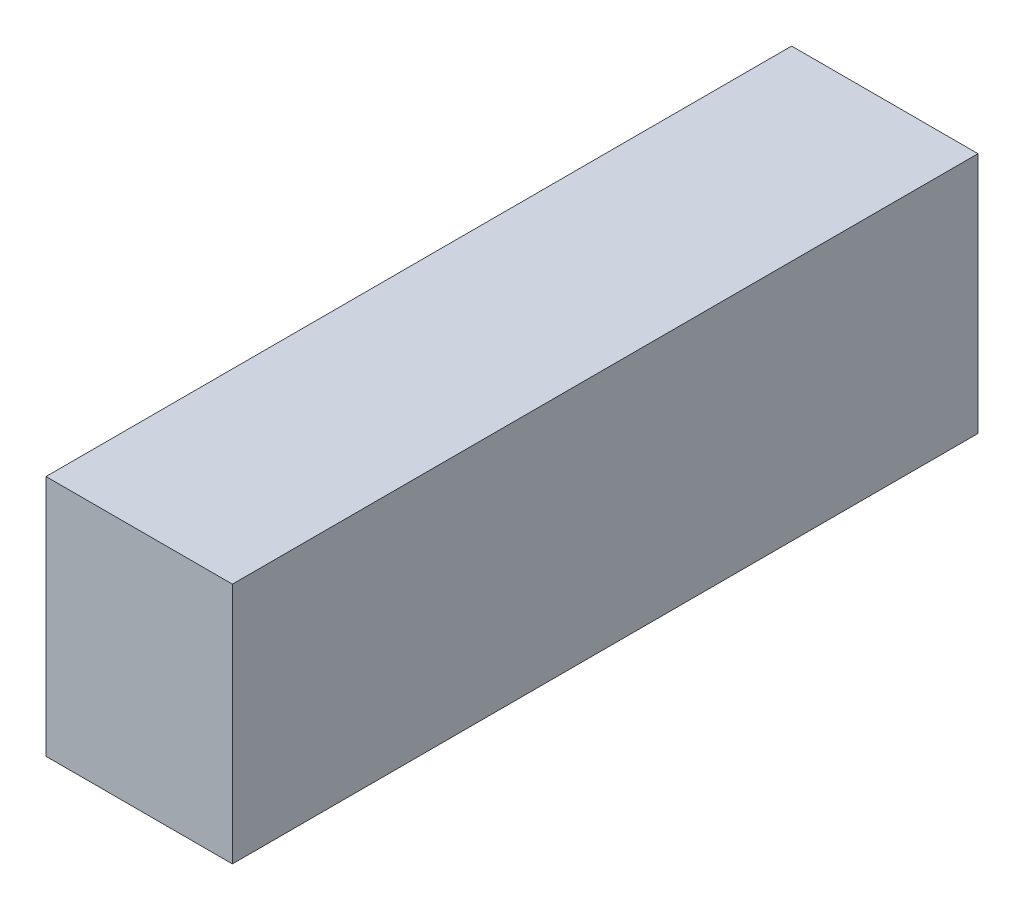
ISO-10303-21;
HEADER;
FILE_DESCRIPTION(('STEP AP214'),'2;1');
FILE_NAME('part.step','',(''),(''),'','','');
FILE_SCHEMA(('AUTOMOTIVE_DESIGN { 1 0 10303 214 1 1 1 1 }'));
ENDSEC;
DATA;
#1=APPLICATION_CONTEXT('core data for automotive mechanical design processes');
#2=APPLICATION_PROTOCOL_DEFINITION('international standard','automotive_design',2000,#1);
#3=PRODUCT_CONTEXT('',#1,'mechanical');
#4=PRODUCT('Part','Part','',(#3));
#5=PRODUCT_RELATED_PRODUCT_CATEGORY('part','',(#4));
#6=PRODUCT_DEFINITION_FORMATION('','',#4);
#7=PRODUCT_DEFINITION_CONTEXT('part definition',#1,'design');
#8=PRODUCT_DEFINITION('design','',#6,#7);
#9=PRODUCT_DEFINITION_SHAPE('','',#8);
#10=(LENGTH_UNIT() NAMED_UNIT(*) SI_UNIT(.MILLI.,.METRE.));
#11=(NAMED_UNIT(*) PLANE_ANGLE_UNIT() SI_UNIT($,.RADIAN.));
#12=(NAMED_UNIT(*) SI_UNIT($,.STERADIAN.) SOLID_ANGLE_UNIT());
#13=UNCERTAINTY_MEASURE_WITH_UNIT(LENGTH_MEASURE(1.E-05),#10,'distance_accuracy_value','');
#14=(GEOMETRIC_REPRESENTATION_CONTEXT(3) GLOBAL_UNCERTAINTY_ASSIGNED_CONTEXT((#13)) GLOBAL_UNIT_ASSIGNED_CONTEXT((#10,
#11,#12)) REPRESENTATION_CONTEXT('',''));
#15=CARTESIAN_POINT('',(0.,0.,0.));
#16=DIRECTION('',(0.,0.,1.));
#17=DIRECTION('',(1.,0.,0.));
#18=AXIS2_PLACEMENT_3D('',#15,#16,#17);
#19=CARTESIAN_POINT('',(-10.,0.,0.));
#20=DIRECTION('',(0.,0.,1.));
#21=DIRECTION('',(1.,0.,0.));
#22=AXIS2_PLACEMENT_3D('',#19,#20,#21);
#23=PLANE('',#22);
#24=DIRECTION('',(0.,-1.,0.));
#25=VECTOR('',#24,1.);
#26=CARTESIAN_POINT('',(0.,0.,0.));
#27=LINE('',#26,#25);
#28=CARTESIAN_POINT('',(0.,13.,0.));
#29=VERTEX_POINT('',#28);
#30=CARTESIAN_POINT('',(0.,0.,0.));
#31=VERTEX_POINT('',#30);
#32=EDGE_CURVE('E104',#29,#31,#27,.T.);
#33=ORIENTED_EDGE('',*,*,#32,.F.);
#34=DIRECTION('',(1.,0.,0.));
#35=VECTOR('',#34,1.);
#36=CARTESIAN_POINT('',(-10.,13.,0.));
#37=LINE('',#36,#35);
#38=CARTESIAN_POINT('',(-10.,13.,0.));
#39=VERTEX_POINT('',#38);
#40=EDGE_CURVE('E11',#39,#29,#37,.T.);
#41=ORIENTED_EDGE('',*,*,#40,.F.);
#42=DIRECTION('',(0.,-1.,0.));
#43=VECTOR('',#42,1.);
#44=CARTESIAN_POINT('',(-10.,0.,0.));
#45=LINE('',#44,#43);
#46=CARTESIAN_POINT('',(-10.,0.,0.));
#47=VERTEX_POINT('',#46);
#48=EDGE_CURVE('E100',#39,#47,#45,.T.);
#49=ORIENTED_EDGE('',*,*,#48,.T.);
#50=DIRECTION('',(1.,0.,0.));
#51=VECTOR('',#50,1.);
#52=CARTESIAN_POINT('',(-10.,0.,0.));
#53=LINE('',#52,#51);
#54=EDGE_CURVE('E45',#47,#31,#53,.T.);
#55=ORIENTED_EDGE('',*,*,#54,.T.);
#56=EDGE_LOOP('',(#33,#41,#49,#55));
#57=FACE_BOUND('',#56,.T.);
#58=ADVANCED_FACE('F39',(#57),#23,.T.);
#59=CARTESIAN_POINT('',(-10.,13.,0.));
#60=DIRECTION('',(0.,1.,0.));
#61=DIRECTION('',(0.,0.,1.));
#62=AXIS2_PLACEMENT_3D('',#59,#60,#61);
#63=PLANE('',#62);
#64=DIRECTION('',(0.,0.,1.));
#65=VECTOR('',#64,1.);
#66=CARTESIAN_POINT('',(0.,13.,0.));
#67=LINE('',#66,#65);
#68=CARTESIAN_POINT('',(0.,13.,-40.));
#69=VERTEX_POINT('',#68);
#70=EDGE_CURVE('E98',#69,#29,#67,.T.);
#71=ORIENTED_EDGE('',*,*,#70,.F.);
#72=DIRECTION('',(1.,0.,0.));
#73=VECTOR('',#72,1.);
#74=CARTESIAN_POINT('',(-10.,13.,-40.));
#75=LINE('',#74,#73);
#76=CARTESIAN_POINT('',(-10.,13.,-40.));
#77=VERTEX_POINT('',#76);
#78=EDGE_CURVE('E48',#77,#69,#75,.T.);
#79=ORIENTED_EDGE('',*,*,#78,.F.);
#80=DIRECTION('',(0.,0.,1.));
#81=VECTOR('',#80,1.);
#82=CARTESIAN_POINT('',(-10.,13.,0.));
#83=LINE('',#82,#81);
#84=EDGE_CURVE('E92',#77,#39,#83,.T.);
#85=ORIENTED_EDGE('',*,*,#84,.T.);
#86=ORIENTED_EDGE('',*,*,#40,.T.);
#87=EDGE_LOOP('',(#71,#79,#85,#86));
#88=FACE_BOUND('',#87,.T.);
#89=ADVANCED_FACE('F111',(#88),#63,.T.);
#90=CARTESIAN_POINT('',(-10.,0.,-40.));
#91=DIRECTION('',(0.,0.,-1.));
#92=DIRECTION('',(-1.,0.,0.));
#93=AXIS2_PLACEMENT_3D('',#90,#91,#92);
#94=PLANE('',#93);
#95=DIRECTION('',(0.,1.,0.));
#96=VECTOR('',#95,1.);
#97=CARTESIAN_POINT('',(0.,0.,-40.));
#98=LINE('',#97,#96);
#99=CARTESIAN_POINT('',(0.,0.,-40.));
#100=VERTEX_POINT('',#99);
#101=EDGE_CURVE('E87',#100,#69,#98,.T.);
#102=ORIENTED_EDGE('',*,*,#101,.F.);
#103=DIRECTION('',(1.,0.,0.));
#104=VECTOR('',#103,1.);
#105=CARTESIAN_POINT('',(-10.,0.,-40.));
#106=LINE('',#105,#104);
#107=CARTESIAN_POINT('',(-10.,0.,-40.));
#108=VERTEX_POINT('',#107);
#109=EDGE_CURVE('E84',#108,#100,#106,.T.);
#110=ORIENTED_EDGE('',*,*,#109,.F.);
#111=DIRECTION('',(0.,1.,0.));
#112=VECTOR('',#111,1.);
#113=CARTESIAN_POINT('',(-10.,0.,-40.));
#114=LINE('',#113,#112);
#115=EDGE_CURVE('E90',#108,#77,#114,.T.);
#116=ORIENTED_EDGE('',*,*,#115,.T.);
#117=ORIENTED_EDGE('',*,*,#78,.T.);
#118=EDGE_LOOP('',(#102,#110,#116,#117));
#119=FACE_BOUND('',#118,.T.);
#120=ADVANCED_FACE('F86',(#119),#94,.T.);
#121=CARTESIAN_POINT('',(-10.,0.,0.));
#122=DIRECTION('',(0.,-1.,0.));
#123=DIRECTION('',(0.,0.,-1.));
#124=AXIS2_PLACEMENT_3D('',#121,#122,#123);
#125=PLANE('',#124);
#126=DIRECTION('',(0.,0.,-1.));
#127=VECTOR('',#126,1.);
#128=CARTESIAN_POINT('',(0.,0.,0.));
#129=LINE('',#128,#127);
#130=EDGE_CURVE('E106',#31,#100,#129,.T.);
#131=ORIENTED_EDGE('',*,*,#130,.F.);
#132=ORIENTED_EDGE('',*,*,#54,.F.);
#133=DIRECTION('',(0.,0.,-1.));
#134=VECTOR('',#133,1.);
#135=CARTESIAN_POINT('',(-10.,0.,0.));
#136=LINE('',#135,#134);
#137=EDGE_CURVE('E93',#47,#108,#136,.T.);
#138=ORIENTED_EDGE('',*,*,#137,.T.);
#139=ORIENTED_EDGE('',*,*,#109,.T.);
#140=EDGE_LOOP('',(#131,#132,#138,#139));
#141=FACE_BOUND('',#140,.T.);
#142=ADVANCED_FACE('F96',(#141),#125,.T.);
#143=CARTESIAN_POINT('',(-10.,0.,0.));
#144=DIRECTION('',(-1.,0.,0.));
#145=DIRECTION('',(0.,0.,1.));
#146=AXIS2_PLACEMENT_3D('',#143,#144,#145);
#147=PLANE('',#146);
#148=ORIENTED_EDGE('',*,*,#48,.F.);
#149=ORIENTED_EDGE('',*,*,#84,.F.);
#150=ORIENTED_EDGE('',*,*,#115,.F.);
#151=ORIENTED_EDGE('',*,*,#137,.F.);
#152=EDGE_LOOP('',(#148,#149,#150,#151));
#153=FACE_BOUND('',#152,.T.);
#154=ADVANCED_FACE('F95',(#153),#147,.T.);
#155=CARTESIAN_POINT('',(0.,0.,0.));
#156=DIRECTION('',(-1.,0.,0.));
#157=DIRECTION('',(0.,0.,1.));
#158=AXIS2_PLACEMENT_3D('',#155,#156,#157);
#159=PLANE('',#158);
#160=ORIENTED_EDGE('',*,*,#32,.T.);
#161=ORIENTED_EDGE('',*,*,#130,.T.);
#162=ORIENTED_EDGE('',*,*,#101,.T.);
#163=ORIENTED_EDGE('',*,*,#70,.T.);
#164=EDGE_LOOP('',(#160,#161,#162,#163));
#165=FACE_BOUND('',#164,.T.);
#166=ADVANCED_FACE('F115',(#165),#159,.F.);
#167=CLOSED_SHELL('',(#58,#89,#120,#142,#154,#166));
#168=MANIFOLD_SOLID_BREP('B2',#167);
#169=ADVANCED_BREP_SHAPE_REPRESENTATION('',(#18,#168),#14);
#170=SHAPE_DEFINITION_REPRESENTATION(#9,#169);
ENDSEC;
END-ISO-10303-21;
